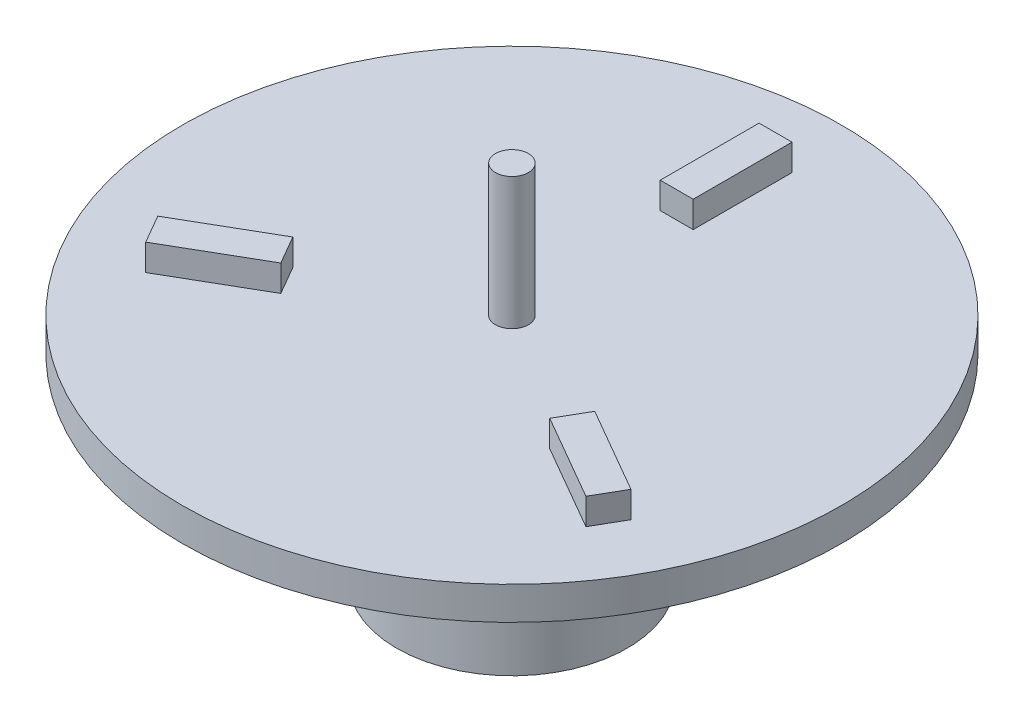
ISO-10303-21;
HEADER;
FILE_DESCRIPTION(('STEP AP214'),'2;1');
FILE_NAME('part.step','',(''),(''),'','','');
FILE_SCHEMA(('AUTOMOTIVE_DESIGN { 1 0 10303 214 1 1 1 1 }'));
ENDSEC;
DATA;
#1=APPLICATION_CONTEXT('core data for automotive mechanical design processes');
#2=APPLICATION_PROTOCOL_DEFINITION('international standard','automotive_design',2000,#1);
#3=PRODUCT_CONTEXT('',#1,'mechanical');
#4=PRODUCT('Part','Part','',(#3));
#5=PRODUCT_RELATED_PRODUCT_CATEGORY('part','',(#4));
#6=PRODUCT_DEFINITION_FORMATION('','',#4);
#7=PRODUCT_DEFINITION_CONTEXT('part definition',#1,'design');
#8=PRODUCT_DEFINITION('design','',#6,#7);
#9=PRODUCT_DEFINITION_SHAPE('','',#8);
#10=(LENGTH_UNIT() NAMED_UNIT(*) SI_UNIT(.MILLI.,.METRE.));
#11=(NAMED_UNIT(*) PLANE_ANGLE_UNIT() SI_UNIT($,.RADIAN.));
#12=(NAMED_UNIT(*) SI_UNIT($,.STERADIAN.) SOLID_ANGLE_UNIT());
#13=UNCERTAINTY_MEASURE_WITH_UNIT(LENGTH_MEASURE(1.E-05),#10,'distance_accuracy_value','');
#14=(GEOMETRIC_REPRESENTATION_CONTEXT(3) GLOBAL_UNCERTAINTY_ASSIGNED_CONTEXT((#13)) GLOBAL_UNIT_ASSIGNED_CONTEXT((#10,
#11,#12)) REPRESENTATION_CONTEXT('',''));
#15=CARTESIAN_POINT('',(0.,0.,0.));
#16=DIRECTION('',(0.,0.,1.));
#17=DIRECTION('',(1.,0.,0.));
#18=AXIS2_PLACEMENT_3D('',#15,#16,#17);
#19=CARTESIAN_POINT('',(0.,7.,0.));
#20=DIRECTION('',(0.,1.,0.));
#21=DIRECTION('',(0.,0.,1.));
#22=AXIS2_PLACEMENT_3D('',#19,#20,#21);
#23=PLANE('',#22);
#24=CARTESIAN_POINT('',(0.,7.,0.));
#25=DIRECTION('',(0.,1.,0.));
#26=DIRECTION('',(0.,0.,1.));
#27=AXIS2_PLACEMENT_3D('',#24,#25,#26);
#28=CIRCLE('',#27,0.5);
#29=CARTESIAN_POINT('',(0.,7.,0.5));
#30=VERTEX_POINT('',#29);
#31=EDGE_CURVE('E220',#30,#30,#28,.T.);
#32=ORIENTED_EDGE('',*,*,#31,.F.);
#33=EDGE_LOOP('',(#32));
#34=FACE_BOUND('',#33,.T.);
#35=CARTESIAN_POINT('',(0.,7.,0.));
#36=DIRECTION('',(0.,1.,0.));
#37=DIRECTION('',(0.,0.,1.));
#38=AXIS2_PLACEMENT_3D('',#35,#36,#37);
#39=CIRCLE('',#38,10.);
#40=CARTESIAN_POINT('',(0.,7.,10.));
#41=VERTEX_POINT('',#40);
#42=EDGE_CURVE('E227',#41,#41,#39,.T.);
#43=ORIENTED_EDGE('',*,*,#42,.T.);
#44=EDGE_LOOP('',(#43));
#45=FACE_BOUND('',#44,.T.);
#46=DIRECTION('',(0.,0.,-1.));
#47=VECTOR('',#46,1.);
#48=CARTESIAN_POINT('',(0.5,7.,-5.));
#49=LINE('',#48,#47);
#50=CARTESIAN_POINT('',(0.5,7.,-5.));
#51=VERTEX_POINT('',#50);
#52=CARTESIAN_POINT('',(0.5,7.,-8.));
#53=VERTEX_POINT('',#52);
#54=EDGE_CURVE('E204',#51,#53,#49,.T.);
#55=ORIENTED_EDGE('',*,*,#54,.F.);
#56=DIRECTION('',(1.,0.,0.));
#57=VECTOR('',#56,1.);
#58=CARTESIAN_POINT('',(0.,7.,-5.));
#59=LINE('',#58,#57);
#60=CARTESIAN_POINT('',(-0.5,7.,-5.));
#61=VERTEX_POINT('',#60);
#62=EDGE_CURVE('E192',#61,#51,#59,.T.);
#63=ORIENTED_EDGE('',*,*,#62,.F.);
#64=DIRECTION('',(0.,0.,1.));
#65=VECTOR('',#64,1.);
#66=CARTESIAN_POINT('',(-0.5,7.,-8.));
#67=LINE('',#66,#65);
#68=CARTESIAN_POINT('',(-0.5,7.,-8.));
#69=VERTEX_POINT('',#68);
#70=EDGE_CURVE('E196',#69,#61,#67,.T.);
#71=ORIENTED_EDGE('',*,*,#70,.F.);
#72=DIRECTION('',(-1.,0.,0.));
#73=VECTOR('',#72,1.);
#74=CARTESIAN_POINT('',(0.5,7.,-8.));
#75=LINE('',#74,#73);
#76=EDGE_CURVE('E206',#53,#69,#75,.T.);
#77=ORIENTED_EDGE('',*,*,#76,.F.);
#78=EDGE_LOOP('',(#55,#63,#71,#77));
#79=FACE_BOUND('',#78,.T.);
#80=DIRECTION('',(-0.866025403784436,0.,0.500000000000004));
#81=VECTOR('',#80,1.);
#82=CARTESIAN_POINT('',(-4.58012701892218,7.,2.0669872981078));
#83=LINE('',#82,#81);
#84=CARTESIAN_POINT('',(-4.58012701892218,7.,2.0669872981078));
#85=VERTEX_POINT('',#84);
#86=CARTESIAN_POINT('',(-7.17820323027549,7.,3.56698729810781));
#87=VERTEX_POINT('',#86);
#88=EDGE_CURVE('E178',#85,#87,#83,.T.);
#89=ORIENTED_EDGE('',*,*,#88,.F.);
#90=DIRECTION('',(-0.500000000000004,0.,-0.866025403784436));
#91=VECTOR('',#90,1.);
#92=CARTESIAN_POINT('',(-4.33012701892218,7.,2.50000000000002));
#93=LINE('',#92,#91);
#94=CARTESIAN_POINT('',(-4.08012701892218,7.,2.93301270189224));
#95=VERTEX_POINT('',#94);
#96=EDGE_CURVE('E146',#95,#85,#93,.T.);
#97=ORIENTED_EDGE('',*,*,#96,.F.);
#98=DIRECTION('',(0.866025403784436,0.,-0.500000000000004));
#99=VECTOR('',#98,1.);
#100=CARTESIAN_POINT('',(-6.67820323027549,7.,4.43301270189225));
#101=LINE('',#100,#99);
#102=CARTESIAN_POINT('',(-6.67820323027549,7.,4.43301270189225));
#103=VERTEX_POINT('',#102);
#104=EDGE_CURVE('E170',#103,#95,#101,.T.);
#105=ORIENTED_EDGE('',*,*,#104,.F.);
#106=DIRECTION('',(0.500000000000004,0.,0.866025403784436));
#107=VECTOR('',#106,1.);
#108=CARTESIAN_POINT('',(-7.17820323027549,7.,3.56698729810781));
#109=LINE('',#108,#107);
#110=EDGE_CURVE('E180',#87,#103,#109,.T.);
#111=ORIENTED_EDGE('',*,*,#110,.F.);
#112=EDGE_LOOP('',(#89,#97,#105,#111));
#113=FACE_BOUND('',#112,.T.);
#114=DIRECTION('',(0.866025403784443,0.,0.499999999999992));
#115=VECTOR('',#114,1.);
#116=CARTESIAN_POINT('',(4.08012701892222,7.,2.93301270189218));
#117=LINE('',#116,#115);
#118=CARTESIAN_POINT('',(4.08012701892222,7.,2.93301270189218));
#119=VERTEX_POINT('',#118);
#120=CARTESIAN_POINT('',(6.67820323027555,7.,4.43301270189216));
#121=VERTEX_POINT('',#120);
#122=EDGE_CURVE('E159',#119,#121,#117,.T.);
#123=ORIENTED_EDGE('',*,*,#122,.F.);
#124=DIRECTION('',(-0.499999999999992,0.,0.866025403784443));
#125=VECTOR('',#124,1.);
#126=CARTESIAN_POINT('',(4.33012701892222,7.,2.49999999999996));
#127=LINE('',#126,#125);
#128=CARTESIAN_POINT('',(4.58012701892221,7.,2.06698729810774));
#129=VERTEX_POINT('',#128);
#130=EDGE_CURVE('E143',#129,#119,#127,.T.);
#131=ORIENTED_EDGE('',*,*,#130,.F.);
#132=DIRECTION('',(-0.866025403784443,0.,-0.499999999999992));
#133=VECTOR('',#132,1.);
#134=CARTESIAN_POINT('',(7.17820323027554,7.,3.56698729810771));
#135=LINE('',#134,#133);
#136=CARTESIAN_POINT('',(7.17820323027554,7.,3.56698729810771));
#137=VERTEX_POINT('',#136);
#138=EDGE_CURVE('E137',#137,#129,#135,.T.);
#139=ORIENTED_EDGE('',*,*,#138,.F.);
#140=DIRECTION('',(0.499999999999992,0.,-0.866025403784443));
#141=VECTOR('',#140,1.);
#142=CARTESIAN_POINT('',(6.67820323027555,7.,4.43301270189216));
#143=LINE('',#142,#141);
#144=EDGE_CURVE('E161',#121,#137,#143,.T.);
#145=ORIENTED_EDGE('',*,*,#144,.F.);
#146=EDGE_LOOP('',(#123,#131,#139,#145));
#147=FACE_BOUND('',#146,.T.);
#148=ADVANCED_FACE('F37',(#34,#45,#79,#113,#147),#23,.T.);
#149=CARTESIAN_POINT('',(0.,5.,0.));
#150=DIRECTION('',(0.,-1.,0.));
#151=DIRECTION('',(0.,0.,-1.));
#152=AXIS2_PLACEMENT_3D('',#149,#150,#151);
#153=CYLINDRICAL_SURFACE('',#152,3.5);
#154=CARTESIAN_POINT('',(0.,5.,0.));
#155=DIRECTION('',(0.,1.,0.));
#156=DIRECTION('',(0.,0.,1.));
#157=AXIS2_PLACEMENT_3D('',#154,#155,#156);
#158=CIRCLE('',#157,3.5);
#159=CARTESIAN_POINT('',(0.,5.,3.5));
#160=VERTEX_POINT('',#159);
#161=EDGE_CURVE('E11',#160,#160,#158,.T.);
#162=ORIENTED_EDGE('',*,*,#161,.F.);
#163=EDGE_LOOP('',(#162));
#164=FACE_BOUND('',#163,.T.);
#165=CARTESIAN_POINT('',(0.,0.,0.));
#166=DIRECTION('',(0.,1.,0.));
#167=DIRECTION('',(0.,0.,1.));
#168=AXIS2_PLACEMENT_3D('',#165,#166,#167);
#169=CIRCLE('',#168,3.5);
#170=CARTESIAN_POINT('',(0.,0.,3.5));
#171=VERTEX_POINT('',#170);
#172=EDGE_CURVE('E41',#171,#171,#169,.T.);
#173=ORIENTED_EDGE('',*,*,#172,.T.);
#174=EDGE_LOOP('',(#173));
#175=FACE_BOUND('',#174,.T.);
#176=ADVANCED_FACE('F39',(#164,#175),#153,.T.);
#177=CARTESIAN_POINT('',(0.,0.,0.));
#178=DIRECTION('',(0.,1.,0.));
#179=DIRECTION('',(0.,0.,1.));
#180=AXIS2_PLACEMENT_3D('',#177,#178,#179);
#181=PLANE('',#180);
#182=ORIENTED_EDGE('',*,*,#172,.F.);
#183=EDGE_LOOP('',(#182));
#184=FACE_BOUND('',#183,.T.);
#185=ADVANCED_FACE('F253',(#184),#181,.F.);
#186=CARTESIAN_POINT('',(0.,6.,0.));
#187=DIRECTION('',(0.,-1.,0.));
#188=DIRECTION('',(0.,0.,-1.));
#189=AXIS2_PLACEMENT_3D('',#186,#187,#188);
#190=CYLINDRICAL_SURFACE('',#189,5.5);
#191=CARTESIAN_POINT('',(0.,6.,0.));
#192=DIRECTION('',(0.,1.,0.));
#193=DIRECTION('',(0.,0.,1.));
#194=AXIS2_PLACEMENT_3D('',#191,#192,#193);
#195=CIRCLE('',#194,5.5);
#196=CARTESIAN_POINT('',(0.,6.,5.5));
#197=VERTEX_POINT('',#196);
#198=EDGE_CURVE('E233',#197,#197,#195,.T.);
#199=ORIENTED_EDGE('',*,*,#198,.F.);
#200=EDGE_LOOP('',(#199));
#201=FACE_BOUND('',#200,.T.);
#202=CARTESIAN_POINT('',(0.,5.,0.));
#203=DIRECTION('',(0.,1.,0.));
#204=DIRECTION('',(0.,0.,1.));
#205=AXIS2_PLACEMENT_3D('',#202,#203,#204);
#206=CIRCLE('',#205,5.5);
#207=CARTESIAN_POINT('',(0.,5.,5.5));
#208=VERTEX_POINT('',#207);
#209=EDGE_CURVE('E230',#208,#208,#206,.T.);
#210=ORIENTED_EDGE('',*,*,#209,.T.);
#211=EDGE_LOOP('',(#210));
#212=FACE_BOUND('',#211,.T.);
#213=ADVANCED_FACE('F239',(#201,#212),#190,.T.);
#214=CARTESIAN_POINT('',(0.,5.,0.));
#215=DIRECTION('',(0.,1.,0.));
#216=DIRECTION('',(0.,0.,1.));
#217=AXIS2_PLACEMENT_3D('',#214,#215,#216);
#218=PLANE('',#217);
#219=ORIENTED_EDGE('',*,*,#161,.T.);
#220=EDGE_LOOP('',(#219));
#221=FACE_BOUND('',#220,.T.);
#222=ORIENTED_EDGE('',*,*,#209,.F.);
#223=EDGE_LOOP('',(#222));
#224=FACE_BOUND('',#223,.T.);
#225=ADVANCED_FACE('F241',(#221,#224),#218,.F.);
#226=CARTESIAN_POINT('',(0.,7.,0.));
#227=DIRECTION('',(0.,-1.,0.));
#228=DIRECTION('',(0.,0.,-1.));
#229=AXIS2_PLACEMENT_3D('',#226,#227,#228);
#230=CYLINDRICAL_SURFACE('',#229,10.);
#231=ORIENTED_EDGE('',*,*,#42,.F.);
#232=EDGE_LOOP('',(#231));
#233=FACE_BOUND('',#232,.T.);
#234=CARTESIAN_POINT('',(0.,6.,0.));
#235=DIRECTION('',(0.,1.,0.));
#236=DIRECTION('',(0.,0.,1.));
#237=AXIS2_PLACEMENT_3D('',#234,#235,#236);
#238=CIRCLE('',#237,10.);
#239=CARTESIAN_POINT('',(0.,6.,10.));
#240=VERTEX_POINT('',#239);
#241=EDGE_CURVE('E224',#240,#240,#238,.T.);
#242=ORIENTED_EDGE('',*,*,#241,.T.);
#243=EDGE_LOOP('',(#242));
#244=FACE_BOUND('',#243,.T.);
#245=ADVANCED_FACE('F243',(#233,#244),#230,.T.);
#246=CARTESIAN_POINT('',(0.,6.,0.));
#247=DIRECTION('',(0.,1.,0.));
#248=DIRECTION('',(0.,0.,1.));
#249=AXIS2_PLACEMENT_3D('',#246,#247,#248);
#250=PLANE('',#249);
#251=ORIENTED_EDGE('',*,*,#198,.T.);
#252=EDGE_LOOP('',(#251));
#253=FACE_BOUND('',#252,.T.);
#254=ORIENTED_EDGE('',*,*,#241,.F.);
#255=EDGE_LOOP('',(#254));
#256=FACE_BOUND('',#255,.T.);
#257=ADVANCED_FACE('F250',(#253,#256),#250,.F.);
#258=CARTESIAN_POINT('',(0.,11.,0.));
#259=DIRECTION('',(0.,-1.,0.));
#260=DIRECTION('',(0.,0.,-1.));
#261=AXIS2_PLACEMENT_3D('',#258,#259,#260);
#262=CYLINDRICAL_SURFACE('',#261,0.5);
#263=CARTESIAN_POINT('',(0.,11.,0.));
#264=DIRECTION('',(0.,1.,0.));
#265=DIRECTION('',(0.,0.,1.));
#266=AXIS2_PLACEMENT_3D('',#263,#264,#265);
#267=CIRCLE('',#266,0.5);
#268=CARTESIAN_POINT('',(0.,11.,0.5));
#269=VERTEX_POINT('',#268);
#270=EDGE_CURVE('E221',#269,#269,#267,.T.);
#271=ORIENTED_EDGE('',*,*,#270,.F.);
#272=EDGE_LOOP('',(#271));
#273=FACE_BOUND('',#272,.T.);
#274=ORIENTED_EDGE('',*,*,#31,.T.);
#275=EDGE_LOOP('',(#274));
#276=FACE_BOUND('',#275,.T.);
#277=ADVANCED_FACE('F267',(#273,#276),#262,.T.);
#278=CARTESIAN_POINT('',(0.,11.,0.));
#279=DIRECTION('',(0.,1.,0.));
#280=DIRECTION('',(0.,0.,1.));
#281=AXIS2_PLACEMENT_3D('',#278,#279,#280);
#282=PLANE('',#281);
#283=ORIENTED_EDGE('',*,*,#270,.T.);
#284=EDGE_LOOP('',(#283));
#285=FACE_BOUND('',#284,.T.);
#286=ADVANCED_FACE('F274',(#285),#282,.T.);
#287=CARTESIAN_POINT('',(0.,7.8,-5.));
#288=DIRECTION('',(0.,0.,-1.));
#289=DIRECTION('',(-1.,0.,0.));
#290=AXIS2_PLACEMENT_3D('',#287,#288,#289);
#291=PLANE('',#290);
#292=ORIENTED_EDGE('',*,*,#62,.T.);
#293=DIRECTION('',(0.,-1.,0.));
#294=VECTOR('',#293,1.);
#295=CARTESIAN_POINT('',(0.5,7.8,-5.));
#296=LINE('',#295,#294);
#297=CARTESIAN_POINT('',(0.5,7.8,-5.));
#298=VERTEX_POINT('',#297);
#299=EDGE_CURVE('E217',#298,#51,#296,.T.);
#300=ORIENTED_EDGE('',*,*,#299,.F.);
#301=DIRECTION('',(1.,0.,0.));
#302=VECTOR('',#301,1.);
#303=CARTESIAN_POINT('',(-0.5,7.8,-5.));
#304=LINE('',#303,#302);
#305=CARTESIAN_POINT('',(-0.5,7.8,-5.));
#306=VERTEX_POINT('',#305);
#307=EDGE_CURVE('E193',#306,#298,#304,.T.);
#308=ORIENTED_EDGE('',*,*,#307,.F.);
#309=DIRECTION('',(0.,-1.,0.));
#310=VECTOR('',#309,1.);
#311=CARTESIAN_POINT('',(-0.5,7.8,-5.));
#312=LINE('',#311,#310);
#313=EDGE_CURVE('E202',#306,#61,#312,.T.);
#314=ORIENTED_EDGE('',*,*,#313,.T.);
#315=EDGE_LOOP('',(#292,#300,#308,#314));
#316=FACE_BOUND('',#315,.T.);
#317=ADVANCED_FACE('F283',(#316),#291,.F.);
#318=CARTESIAN_POINT('',(0.5,7.8,-5.));
#319=DIRECTION('',(-1.,0.,0.));
#320=DIRECTION('',(0.,0.,1.));
#321=AXIS2_PLACEMENT_3D('',#318,#319,#320);
#322=PLANE('',#321);
#323=ORIENTED_EDGE('',*,*,#54,.T.);
#324=DIRECTION('',(0.,-1.,0.));
#325=VECTOR('',#324,1.);
#326=CARTESIAN_POINT('',(0.5,7.8,-8.));
#327=LINE('',#326,#325);
#328=CARTESIAN_POINT('',(0.5,7.8,-8.));
#329=VERTEX_POINT('',#328);
#330=EDGE_CURVE('E214',#329,#53,#327,.T.);
#331=ORIENTED_EDGE('',*,*,#330,.F.);
#332=DIRECTION('',(0.,0.,-1.));
#333=VECTOR('',#332,1.);
#334=CARTESIAN_POINT('',(0.5,7.8,-5.));
#335=LINE('',#334,#333);
#336=EDGE_CURVE('E195',#298,#329,#335,.T.);
#337=ORIENTED_EDGE('',*,*,#336,.F.);
#338=ORIENTED_EDGE('',*,*,#299,.T.);
#339=EDGE_LOOP('',(#323,#331,#337,#338));
#340=FACE_BOUND('',#339,.T.);
#341=ADVANCED_FACE('F290',(#340),#322,.F.);
#342=CARTESIAN_POINT('',(0.5,7.8,-8.));
#343=DIRECTION('',(0.,0.,1.));
#344=DIRECTION('',(1.,0.,0.));
#345=AXIS2_PLACEMENT_3D('',#342,#343,#344);
#346=PLANE('',#345);
#347=ORIENTED_EDGE('',*,*,#76,.T.);
#348=DIRECTION('',(0.,-1.,0.));
#349=VECTOR('',#348,1.);
#350=CARTESIAN_POINT('',(-0.5,7.8,-8.));
#351=LINE('',#350,#349);
#352=CARTESIAN_POINT('',(-0.5,7.8,-8.));
#353=VERTEX_POINT('',#352);
#354=EDGE_CURVE('E212',#353,#69,#351,.T.);
#355=ORIENTED_EDGE('',*,*,#354,.F.);
#356=DIRECTION('',(-1.,0.,0.));
#357=VECTOR('',#356,1.);
#358=CARTESIAN_POINT('',(0.5,7.8,-8.));
#359=LINE('',#358,#357);
#360=EDGE_CURVE('E198',#329,#353,#359,.T.);
#361=ORIENTED_EDGE('',*,*,#360,.F.);
#362=ORIENTED_EDGE('',*,*,#330,.T.);
#363=EDGE_LOOP('',(#347,#355,#361,#362));
#364=FACE_BOUND('',#363,.T.);
#365=ADVANCED_FACE('F296',(#364),#346,.F.);
#366=CARTESIAN_POINT('',(-0.5,7.8,-8.));
#367=DIRECTION('',(1.,0.,0.));
#368=DIRECTION('',(0.,0.,-1.));
#369=AXIS2_PLACEMENT_3D('',#366,#367,#368);
#370=PLANE('',#369);
#371=ORIENTED_EDGE('',*,*,#70,.T.);
#372=ORIENTED_EDGE('',*,*,#313,.F.);
#373=DIRECTION('',(0.,0.,1.));
#374=VECTOR('',#373,1.);
#375=CARTESIAN_POINT('',(-0.5,7.8,-8.));
#376=LINE('',#375,#374);
#377=EDGE_CURVE('E200',#353,#306,#376,.T.);
#378=ORIENTED_EDGE('',*,*,#377,.F.);
#379=ORIENTED_EDGE('',*,*,#354,.T.);
#380=EDGE_LOOP('',(#371,#372,#378,#379));
#381=FACE_BOUND('',#380,.T.);
#382=ADVANCED_FACE('F300',(#381),#370,.F.);
#383=CARTESIAN_POINT('',(0.,7.8,0.));
#384=DIRECTION('',(0.,1.,0.));
#385=DIRECTION('',(0.,0.,1.));
#386=AXIS2_PLACEMENT_3D('',#383,#384,#385);
#387=PLANE('',#386);
#388=ORIENTED_EDGE('',*,*,#307,.T.);
#389=ORIENTED_EDGE('',*,*,#336,.T.);
#390=ORIENTED_EDGE('',*,*,#360,.T.);
#391=ORIENTED_EDGE('',*,*,#377,.T.);
#392=EDGE_LOOP('',(#388,#389,#390,#391));
#393=FACE_BOUND('',#392,.T.);
#394=ADVANCED_FACE('F304',(#393),#387,.T.);
#395=CARTESIAN_POINT('',(-4.33012701892218,7.8,2.50000000000002));
#396=DIRECTION('',(-0.866025403784436,0.,0.500000000000004));
#397=DIRECTION('',(0.500000000000004,0.,0.866025403784436));
#398=AXIS2_PLACEMENT_3D('',#395,#396,#397);
#399=PLANE('',#398);
#400=ORIENTED_EDGE('',*,*,#96,.T.);
#401=DIRECTION('',(0.,-1.,0.));
#402=VECTOR('',#401,1.);
#403=CARTESIAN_POINT('',(-4.58012701892218,7.8,2.0669872981078));
#404=LINE('',#403,#402);
#405=CARTESIAN_POINT('',(-4.58012701892218,7.8,2.0669872981078));
#406=VERTEX_POINT('',#405);
#407=EDGE_CURVE('E189',#406,#85,#404,.T.);
#408=ORIENTED_EDGE('',*,*,#407,.F.);
#409=DIRECTION('',(-0.500000000000004,0.,-0.866025403784436));
#410=VECTOR('',#409,1.);
#411=CARTESIAN_POINT('',(-4.08012701892218,7.8,2.93301270189224));
#412=LINE('',#411,#410);
#413=CARTESIAN_POINT('',(-4.08012701892218,7.8,2.93301270189224));
#414=VERTEX_POINT('',#413);
#415=EDGE_CURVE('E167',#414,#406,#412,.T.);
#416=ORIENTED_EDGE('',*,*,#415,.F.);
#417=DIRECTION('',(0.,-1.,0.));
#418=VECTOR('',#417,1.);
#419=CARTESIAN_POINT('',(-4.08012701892218,7.8,2.93301270189224));
#420=LINE('',#419,#418);
#421=EDGE_CURVE('E176',#414,#95,#420,.T.);
#422=ORIENTED_EDGE('',*,*,#421,.T.);
#423=EDGE_LOOP('',(#400,#408,#416,#422));
#424=FACE_BOUND('',#423,.T.);
#425=ADVANCED_FACE('F308',(#424),#399,.F.);
#426=CARTESIAN_POINT('',(-4.58012701892218,7.8,2.0669872981078));
#427=DIRECTION('',(0.500000000000004,0.,0.866025403784436));
#428=DIRECTION('',(0.866025403784436,0.,-0.500000000000004));
#429=AXIS2_PLACEMENT_3D('',#426,#427,#428);
#430=PLANE('',#429);
#431=ORIENTED_EDGE('',*,*,#88,.T.);
#432=DIRECTION('',(0.,-1.,0.));
#433=VECTOR('',#432,1.);
#434=CARTESIAN_POINT('',(-7.17820323027549,7.8,3.56698729810781));
#435=LINE('',#434,#433);
#436=CARTESIAN_POINT('',(-7.17820323027549,7.8,3.56698729810781));
#437=VERTEX_POINT('',#436);
#438=EDGE_CURVE('E186',#437,#87,#435,.T.);
#439=ORIENTED_EDGE('',*,*,#438,.F.);
#440=DIRECTION('',(-0.866025403784436,0.,0.500000000000004));
#441=VECTOR('',#440,1.);
#442=CARTESIAN_POINT('',(-4.58012701892218,7.8,2.0669872981078));
#443=LINE('',#442,#441);
#444=EDGE_CURVE('E169',#406,#437,#443,.T.);
#445=ORIENTED_EDGE('',*,*,#444,.F.);
#446=ORIENTED_EDGE('',*,*,#407,.T.);
#447=EDGE_LOOP('',(#431,#439,#445,#446));
#448=FACE_BOUND('',#447,.T.);
#449=ADVANCED_FACE('F312',(#448),#430,.F.);
#450=CARTESIAN_POINT('',(-7.17820323027549,7.8,3.56698729810781));
#451=DIRECTION('',(0.866025403784436,0.,-0.500000000000004));
#452=DIRECTION('',(-0.500000000000004,0.,-0.866025403784436));
#453=AXIS2_PLACEMENT_3D('',#450,#451,#452);
#454=PLANE('',#453);
#455=ORIENTED_EDGE('',*,*,#110,.T.);
#456=DIRECTION('',(0.,-1.,0.));
#457=VECTOR('',#456,1.);
#458=CARTESIAN_POINT('',(-6.67820323027549,7.8,4.43301270189225));
#459=LINE('',#458,#457);
#460=CARTESIAN_POINT('',(-6.67820323027549,7.8,4.43301270189225));
#461=VERTEX_POINT('',#460);
#462=EDGE_CURVE('E60',#461,#103,#459,.T.);
#463=ORIENTED_EDGE('',*,*,#462,.F.);
#464=DIRECTION('',(0.500000000000004,0.,0.866025403784436));
#465=VECTOR('',#464,1.);
#466=CARTESIAN_POINT('',(-7.17820323027549,7.8,3.56698729810781));
#467=LINE('',#466,#465);
#468=EDGE_CURVE('E172',#437,#461,#467,.T.);
#469=ORIENTED_EDGE('',*,*,#468,.F.);
#470=ORIENTED_EDGE('',*,*,#438,.T.);
#471=EDGE_LOOP('',(#455,#463,#469,#470));
#472=FACE_BOUND('',#471,.T.);
#473=ADVANCED_FACE('F316',(#472),#454,.F.);
#474=CARTESIAN_POINT('',(-6.67820323027549,7.8,4.43301270189225));
#475=DIRECTION('',(-0.500000000000004,0.,-0.866025403784436));
#476=DIRECTION('',(-0.866025403784436,0.,0.500000000000004));
#477=AXIS2_PLACEMENT_3D('',#474,#475,#476);
#478=PLANE('',#477);
#479=ORIENTED_EDGE('',*,*,#104,.T.);
#480=ORIENTED_EDGE('',*,*,#421,.F.);
#481=DIRECTION('',(0.866025403784436,0.,-0.500000000000004));
#482=VECTOR('',#481,1.);
#483=CARTESIAN_POINT('',(-6.67820323027549,7.8,4.43301270189225));
#484=LINE('',#483,#482);
#485=EDGE_CURVE('E174',#461,#414,#484,.T.);
#486=ORIENTED_EDGE('',*,*,#485,.F.);
#487=ORIENTED_EDGE('',*,*,#462,.T.);
#488=EDGE_LOOP('',(#479,#480,#486,#487));
#489=FACE_BOUND('',#488,.T.);
#490=ADVANCED_FACE('F320',(#489),#478,.F.);
#491=CARTESIAN_POINT('',(0.,7.8,0.));
#492=DIRECTION('',(0.,1.,0.));
#493=DIRECTION('',(0.866025403784436,0.,-0.500000000000004));
#494=AXIS2_PLACEMENT_3D('',#491,#492,#493);
#495=PLANE('',#494);
#496=ORIENTED_EDGE('',*,*,#415,.T.);
#497=ORIENTED_EDGE('',*,*,#444,.T.);
#498=ORIENTED_EDGE('',*,*,#468,.T.);
#499=ORIENTED_EDGE('',*,*,#485,.T.);
#500=EDGE_LOOP('',(#496,#497,#498,#499));
#501=FACE_BOUND('',#500,.T.);
#502=ADVANCED_FACE('F324',(#501),#495,.T.);
#503=CARTESIAN_POINT('',(4.33012701892222,7.8,2.49999999999996));
#504=DIRECTION('',(0.866025403784443,0.,0.499999999999992));
#505=DIRECTION('',(0.499999999999992,0.,-0.866025403784443));
#506=AXIS2_PLACEMENT_3D('',#503,#504,#505);
#507=PLANE('',#506);
#508=ORIENTED_EDGE('',*,*,#130,.T.);
#509=DIRECTION('',(0.,-1.,0.));
#510=VECTOR('',#509,1.);
#511=CARTESIAN_POINT('',(4.08012701892222,7.8,2.93301270189218));
#512=LINE('',#511,#510);
#513=CARTESIAN_POINT('',(4.08012701892222,7.8,2.93301270189218));
#514=VERTEX_POINT('',#513);
#515=EDGE_CURVE('E140',#514,#119,#512,.T.);
#516=ORIENTED_EDGE('',*,*,#515,.F.);
#517=DIRECTION('',(-0.499999999999992,0.,0.866025403784443));
#518=VECTOR('',#517,1.);
#519=CARTESIAN_POINT('',(4.58012701892221,7.8,2.06698729810774));
#520=LINE('',#519,#518);
#521=CARTESIAN_POINT('',(4.58012701892221,7.8,2.06698729810774));
#522=VERTEX_POINT('',#521);
#523=EDGE_CURVE('E127',#522,#514,#520,.T.);
#524=ORIENTED_EDGE('',*,*,#523,.F.);
#525=DIRECTION('',(0.,-1.,0.));
#526=VECTOR('',#525,1.);
#527=CARTESIAN_POINT('',(4.58012701892221,7.8,2.06698729810774));
#528=LINE('',#527,#526);
#529=EDGE_CURVE('E157',#522,#129,#528,.T.);
#530=ORIENTED_EDGE('',*,*,#529,.T.);
#531=EDGE_LOOP('',(#508,#516,#524,#530));
#532=FACE_BOUND('',#531,.T.);
#533=ADVANCED_FACE('F141',(#532),#507,.F.);
#534=CARTESIAN_POINT('',(4.08012701892222,7.8,2.93301270189218));
#535=DIRECTION('',(0.499999999999992,0.,-0.866025403784443));
#536=DIRECTION('',(-0.866025403784443,0.,-0.499999999999992));
#537=AXIS2_PLACEMENT_3D('',#534,#535,#536);
#538=PLANE('',#537);
#539=ORIENTED_EDGE('',*,*,#122,.T.);
#540=DIRECTION('',(0.,-1.,0.));
#541=VECTOR('',#540,1.);
#542=CARTESIAN_POINT('',(6.67820323027555,7.8,4.43301270189216));
#543=LINE('',#542,#541);
#544=CARTESIAN_POINT('',(6.67820323027555,7.8,4.43301270189216));
#545=VERTEX_POINT('',#544);
#546=EDGE_CURVE('E147',#545,#121,#543,.T.);
#547=ORIENTED_EDGE('',*,*,#546,.F.);
#548=DIRECTION('',(0.866025403784443,0.,0.499999999999992));
#549=VECTOR('',#548,1.);
#550=CARTESIAN_POINT('',(4.08012701892222,7.8,2.93301270189218));
#551=LINE('',#550,#549);
#552=EDGE_CURVE('E131',#514,#545,#551,.T.);
#553=ORIENTED_EDGE('',*,*,#552,.F.);
#554=ORIENTED_EDGE('',*,*,#515,.T.);
#555=EDGE_LOOP('',(#539,#547,#553,#554));
#556=FACE_BOUND('',#555,.T.);
#557=ADVANCED_FACE('F149',(#556),#538,.F.);
#558=CARTESIAN_POINT('',(6.67820323027555,7.8,4.43301270189216));
#559=DIRECTION('',(-0.866025403784443,0.,-0.499999999999992));
#560=DIRECTION('',(-0.499999999999992,0.,0.866025403784443));
#561=AXIS2_PLACEMENT_3D('',#558,#559,#560);
#562=PLANE('',#561);
#563=ORIENTED_EDGE('',*,*,#144,.T.);
#564=DIRECTION('',(0.,-1.,0.));
#565=VECTOR('',#564,1.);
#566=CARTESIAN_POINT('',(7.17820323027554,7.8,3.56698729810771));
#567=LINE('',#566,#565);
#568=CARTESIAN_POINT('',(7.17820323027554,7.8,3.56698729810771));
#569=VERTEX_POINT('',#568);
#570=EDGE_CURVE('E52',#569,#137,#567,.T.);
#571=ORIENTED_EDGE('',*,*,#570,.F.);
#572=DIRECTION('',(0.499999999999992,0.,-0.866025403784443));
#573=VECTOR('',#572,1.);
#574=CARTESIAN_POINT('',(6.67820323027555,7.8,4.43301270189216));
#575=LINE('',#574,#573);
#576=EDGE_CURVE('E152',#545,#569,#575,.T.);
#577=ORIENTED_EDGE('',*,*,#576,.F.);
#578=ORIENTED_EDGE('',*,*,#546,.T.);
#579=EDGE_LOOP('',(#563,#571,#577,#578));
#580=FACE_BOUND('',#579,.T.);
#581=ADVANCED_FACE('F332',(#580),#562,.F.);
#582=CARTESIAN_POINT('',(7.17820323027554,7.8,3.56698729810771));
#583=DIRECTION('',(-0.499999999999992,0.,0.866025403784443));
#584=DIRECTION('',(0.866025403784443,0.,0.499999999999992));
#585=AXIS2_PLACEMENT_3D('',#582,#583,#584);
#586=PLANE('',#585);
#587=ORIENTED_EDGE('',*,*,#138,.T.);
#588=ORIENTED_EDGE('',*,*,#529,.F.);
#589=DIRECTION('',(-0.866025403784443,0.,-0.499999999999992));
#590=VECTOR('',#589,1.);
#591=CARTESIAN_POINT('',(7.17820323027554,7.8,3.56698729810771));
#592=LINE('',#591,#590);
#593=EDGE_CURVE('E133',#569,#522,#592,.T.);
#594=ORIENTED_EDGE('',*,*,#593,.F.);
#595=ORIENTED_EDGE('',*,*,#570,.T.);
#596=EDGE_LOOP('',(#587,#588,#594,#595));
#597=FACE_BOUND('',#596,.T.);
#598=ADVANCED_FACE('F335',(#597),#586,.F.);
#599=CARTESIAN_POINT('',(0.,7.8,0.));
#600=DIRECTION('',(0.,1.,0.));
#601=DIRECTION('',(-0.866025403784443,0.,-0.499999999999992));
#602=AXIS2_PLACEMENT_3D('',#599,#600,#601);
#603=PLANE('',#602);
#604=ORIENTED_EDGE('',*,*,#523,.T.);
#605=ORIENTED_EDGE('',*,*,#552,.T.);
#606=ORIENTED_EDGE('',*,*,#576,.T.);
#607=ORIENTED_EDGE('',*,*,#593,.T.);
#608=EDGE_LOOP('',(#604,#605,#606,#607));
#609=FACE_BOUND('',#608,.T.);
#610=ADVANCED_FACE('F129',(#609),#603,.T.);
#611=CLOSED_SHELL('',(#148,#176,#185,#213,#225,#245,#257,#277,#286,#317,#341,#365,#382,#394,
#425,#449,#473,#490,#502,#533,#557,#581,#598,#610));
#612=MANIFOLD_SOLID_BREP('B2',#611);
#613=ADVANCED_BREP_SHAPE_REPRESENTATION('',(#18,#612),#14);
#614=SHAPE_DEFINITION_REPRESENTATION(#9,#613);
ENDSEC;
END-ISO-10303-21;
